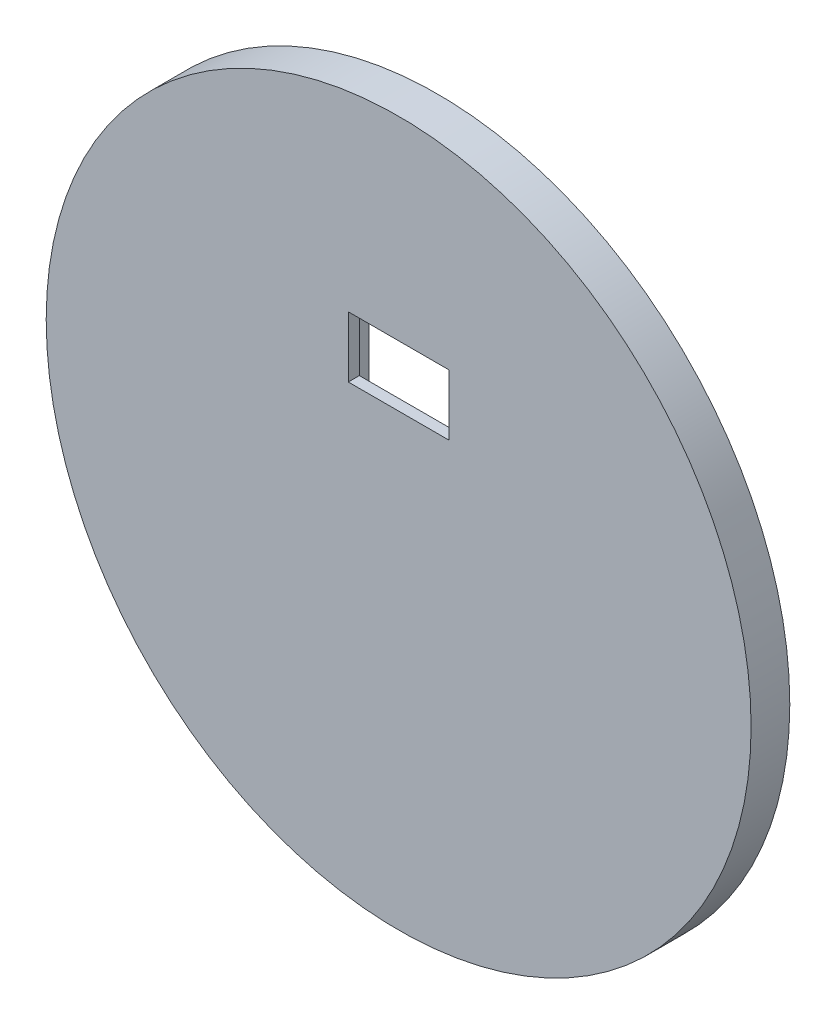
ISO-10303-21;
HEADER;
FILE_DESCRIPTION(('STEP AP214'),'2;1');
FILE_NAME('part.step','',(''),(''),'','','');
FILE_SCHEMA(('AUTOMOTIVE_DESIGN { 1 0 10303 214 1 1 1 1 }'));
ENDSEC;
DATA;
#1=APPLICATION_CONTEXT('core data for automotive mechanical design processes');
#2=APPLICATION_PROTOCOL_DEFINITION('international standard','automotive_design',2000,#1);
#3=PRODUCT_CONTEXT('',#1,'mechanical');
#4=PRODUCT('Part','Part','',(#3));
#5=PRODUCT_RELATED_PRODUCT_CATEGORY('part','',(#4));
#6=PRODUCT_DEFINITION_FORMATION('','',#4);
#7=PRODUCT_DEFINITION_CONTEXT('part definition',#1,'design');
#8=PRODUCT_DEFINITION('design','',#6,#7);
#9=PRODUCT_DEFINITION_SHAPE('','',#8);
#10=(LENGTH_UNIT() NAMED_UNIT(*) SI_UNIT(.MILLI.,.METRE.));
#11=(NAMED_UNIT(*) PLANE_ANGLE_UNIT() SI_UNIT($,.RADIAN.));
#12=(NAMED_UNIT(*) SI_UNIT($,.STERADIAN.) SOLID_ANGLE_UNIT());
#13=UNCERTAINTY_MEASURE_WITH_UNIT(LENGTH_MEASURE(1.E-05),#10,'distance_accuracy_value','');
#14=(GEOMETRIC_REPRESENTATION_CONTEXT(3) GLOBAL_UNCERTAINTY_ASSIGNED_CONTEXT((#13)) GLOBAL_UNIT_ASSIGNED_CONTEXT((#10,
#11,#12)) REPRESENTATION_CONTEXT('',''));
#15=CARTESIAN_POINT('',(0.,0.,0.));
#16=DIRECTION('',(0.,0.,1.));
#17=DIRECTION('',(1.,0.,0.));
#18=AXIS2_PLACEMENT_3D('',#15,#16,#17);
#19=CARTESIAN_POINT('',(0.,0.,7.));
#20=DIRECTION('',(0.,0.,-1.));
#21=DIRECTION('',(-1.,0.,0.));
#22=AXIS2_PLACEMENT_3D('',#19,#20,#21);
#23=CYLINDRICAL_SURFACE('',#22,63.76);
#24=CARTESIAN_POINT('',(0.,0.,7.));
#25=DIRECTION('',(0.,0.,1.));
#26=DIRECTION('',(1.,0.,0.));
#27=AXIS2_PLACEMENT_3D('',#24,#25,#26);
#28=CIRCLE('',#27,63.76);
#29=CARTESIAN_POINT('',(63.76,0.,7.));
#30=VERTEX_POINT('',#29);
#31=EDGE_CURVE('E189',#30,#30,#28,.T.);
#32=ORIENTED_EDGE('',*,*,#31,.F.);
#33=EDGE_LOOP('',(#32));
#34=FACE_BOUND('',#33,.T.);
#35=CARTESIAN_POINT('',(0.,0.,0.));
#36=DIRECTION('',(0.,0.,1.));
#37=DIRECTION('',(1.,0.,0.));
#38=AXIS2_PLACEMENT_3D('',#35,#36,#37);
#39=CIRCLE('',#38,63.76);
#40=CARTESIAN_POINT('',(63.76,0.,0.));
#41=VERTEX_POINT('',#40);
#42=EDGE_CURVE('E178',#41,#41,#39,.T.);
#43=ORIENTED_EDGE('',*,*,#42,.T.);
#44=EDGE_LOOP('',(#43));
#45=FACE_BOUND('',#44,.T.);
#46=ADVANCED_FACE('F39',(#34,#45),#23,.T.);
#47=CARTESIAN_POINT('',(0.,0.,7.));
#48=DIRECTION('',(0.,0.,1.));
#49=DIRECTION('',(1.,0.,0.));
#50=AXIS2_PLACEMENT_3D('',#47,#48,#49);
#51=PLANE('',#50);
#52=DIRECTION('',(0.,1.,0.));
#53=VECTOR('',#52,1.);
#54=CARTESIAN_POINT('',(-9.11201275171163,28.5653825687321,7.));
#55=LINE('',#54,#53);
#56=CARTESIAN_POINT('',(-9.11201275171163,17.5605618518673,7.));
#57=VERTEX_POINT('',#56);
#58=CARTESIAN_POINT('',(-9.11201275171163,28.5653825687321,7.));
#59=VERTEX_POINT('',#58);
#60=EDGE_CURVE('E137',#57,#59,#55,.T.);
#61=ORIENTED_EDGE('',*,*,#60,.T.);
#62=DIRECTION('',(1.,0.,0.));
#63=VECTOR('',#62,1.);
#64=CARTESIAN_POINT('',(9.11201275171163,28.5653825687321,7.));
#65=LINE('',#64,#63);
#66=CARTESIAN_POINT('',(9.11201275171163,28.5653825687321,7.));
#67=VERTEX_POINT('',#66);
#68=EDGE_CURVE('E127',#59,#67,#65,.T.);
#69=ORIENTED_EDGE('',*,*,#68,.T.);
#70=DIRECTION('',(0.,-1.,0.));
#71=VECTOR('',#70,1.);
#72=CARTESIAN_POINT('',(9.11201275171163,28.5653825687321,7.));
#73=LINE('',#72,#71);
#74=CARTESIAN_POINT('',(9.11201275171163,17.5605618518673,7.));
#75=VERTEX_POINT('',#74);
#76=EDGE_CURVE('E153',#67,#75,#73,.T.);
#77=ORIENTED_EDGE('',*,*,#76,.T.);
#78=DIRECTION('',(-1.,0.,0.));
#79=VECTOR('',#78,1.);
#80=CARTESIAN_POINT('',(9.11201275171163,17.5605618518673,7.));
#81=LINE('',#80,#79);
#82=EDGE_CURVE('E149',#75,#57,#81,.T.);
#83=ORIENTED_EDGE('',*,*,#82,.T.);
#84=EDGE_LOOP('',(#61,#69,#77,#83));
#85=FACE_BOUND('',#84,.T.);
#86=ORIENTED_EDGE('',*,*,#31,.T.);
#87=EDGE_LOOP('',(#86));
#88=FACE_BOUND('',#87,.T.);
#89=ADVANCED_FACE('F150',(#85,#88),#51,.T.);
#90=CARTESIAN_POINT('',(0.,0.,0.));
#91=DIRECTION('',(0.,0.,1.));
#92=DIRECTION('',(1.,0.,0.));
#93=AXIS2_PLACEMENT_3D('',#90,#91,#92);
#94=PLANE('',#93);
#95=DIRECTION('',(-1.,0.,0.));
#96=VECTOR('',#95,1.);
#97=CARTESIAN_POINT('',(12.4,-12.42,0.));
#98=LINE('',#97,#96);
#99=CARTESIAN_POINT('',(6.05,-12.42,0.));
#100=VERTEX_POINT('',#99);
#101=CARTESIAN_POINT('',(-6.05,-12.42,0.));
#102=VERTEX_POINT('',#101);
#103=EDGE_CURVE('E182',#100,#102,#98,.T.);
#104=ORIENTED_EDGE('',*,*,#103,.F.);
#105=CARTESIAN_POINT('',(6.05,-6.07,0.));
#106=DIRECTION('',(0.,0.,1.));
#107=DIRECTION('',(1.,0.,0.));
#108=AXIS2_PLACEMENT_3D('',#105,#106,#107);
#109=CIRCLE('',#108,6.35);
#110=CARTESIAN_POINT('',(12.4,-6.06999999999999,0.));
#111=VERTEX_POINT('',#110);
#112=EDGE_CURVE('E50',#100,#111,#109,.T.);
#113=ORIENTED_EDGE('',*,*,#112,.T.);
#114=DIRECTION('',(0.,-1.,0.));
#115=VECTOR('',#114,1.);
#116=CARTESIAN_POINT('',(12.4,32.91,0.));
#117=LINE('',#116,#115);
#118=CARTESIAN_POINT('',(12.4,26.56,0.));
#119=VERTEX_POINT('',#118);
#120=EDGE_CURVE('E134',#119,#111,#117,.T.);
#121=ORIENTED_EDGE('',*,*,#120,.F.);
#122=CARTESIAN_POINT('',(6.05,26.56,0.));
#123=DIRECTION('',(0.,0.,1.));
#124=DIRECTION('',(1.,0.,0.));
#125=AXIS2_PLACEMENT_3D('',#122,#123,#124);
#126=CIRCLE('',#125,6.35);
#127=CARTESIAN_POINT('',(6.05,32.91,0.));
#128=VERTEX_POINT('',#127);
#129=EDGE_CURVE('E225',#119,#128,#126,.T.);
#130=ORIENTED_EDGE('',*,*,#129,.T.);
#131=DIRECTION('',(1.,0.,0.));
#132=VECTOR('',#131,1.);
#133=CARTESIAN_POINT('',(12.4,32.91,0.));
#134=LINE('',#133,#132);
#135=CARTESIAN_POINT('',(-6.04999999999999,32.91,0.));
#136=VERTEX_POINT('',#135);
#137=EDGE_CURVE('E166',#136,#128,#134,.T.);
#138=ORIENTED_EDGE('',*,*,#137,.F.);
#139=CARTESIAN_POINT('',(-6.05,26.56,0.));
#140=DIRECTION('',(0.,0.,1.));
#141=DIRECTION('',(1.,0.,0.));
#142=AXIS2_PLACEMENT_3D('',#139,#140,#141);
#143=CIRCLE('',#142,6.35);
#144=CARTESIAN_POINT('',(-12.4,26.56,0.));
#145=VERTEX_POINT('',#144);
#146=EDGE_CURVE('E221',#136,#145,#143,.T.);
#147=ORIENTED_EDGE('',*,*,#146,.T.);
#148=DIRECTION('',(0.,1.,0.));
#149=VECTOR('',#148,1.);
#150=CARTESIAN_POINT('',(-12.4,32.91,0.));
#151=LINE('',#150,#149);
#152=CARTESIAN_POINT('',(-12.4,-6.06999999999999,0.));
#153=VERTEX_POINT('',#152);
#154=EDGE_CURVE('E184',#153,#145,#151,.T.);
#155=ORIENTED_EDGE('',*,*,#154,.F.);
#156=CARTESIAN_POINT('',(-6.05,-6.07,0.));
#157=DIRECTION('',(0.,0.,1.));
#158=DIRECTION('',(1.,0.,0.));
#159=AXIS2_PLACEMENT_3D('',#156,#157,#158);
#160=CIRCLE('',#159,6.35);
#161=EDGE_CURVE('E11',#153,#102,#160,.T.);
#162=ORIENTED_EDGE('',*,*,#161,.T.);
#163=EDGE_LOOP('',(#104,#113,#121,#130,#138,#147,#155,#162));
#164=FACE_BOUND('',#163,.T.);
#165=ORIENTED_EDGE('',*,*,#42,.F.);
#166=EDGE_LOOP('',(#165));
#167=FACE_BOUND('',#166,.T.);
#168=ADVANCED_FACE('F226',(#164,#167),#94,.F.);
#169=CARTESIAN_POINT('',(12.4,32.91,5.));
#170=DIRECTION('',(1.,0.,0.));
#171=DIRECTION('',(0.,1.,0.));
#172=AXIS2_PLACEMENT_3D('',#169,#170,#171);
#173=PLANE('',#172);
#174=DIRECTION('',(0.,-1.,0.));
#175=VECTOR('',#174,1.);
#176=CARTESIAN_POINT('',(12.4,32.91,5.));
#177=LINE('',#176,#175);
#178=CARTESIAN_POINT('',(12.4,26.56,5.));
#179=VERTEX_POINT('',#178);
#180=CARTESIAN_POINT('',(12.4,-6.06999999999999,5.));
#181=VERTEX_POINT('',#180);
#182=EDGE_CURVE('E164',#179,#181,#177,.T.);
#183=ORIENTED_EDGE('',*,*,#182,.F.);
#184=DIRECTION('',(0.,0.,-1.));
#185=VECTOR('',#184,1.);
#186=CARTESIAN_POINT('',(12.4,26.56,0.));
#187=LINE('',#186,#185);
#188=EDGE_CURVE('E198',#179,#119,#187,.T.);
#189=ORIENTED_EDGE('',*,*,#188,.T.);
#190=ORIENTED_EDGE('',*,*,#120,.T.);
#191=DIRECTION('',(0.,0.,-1.));
#192=VECTOR('',#191,1.);
#193=CARTESIAN_POINT('',(12.4,-6.07,5.));
#194=LINE('',#193,#192);
#195=EDGE_CURVE('E195',#111,#181,#194,.F.);
#196=ORIENTED_EDGE('',*,*,#195,.T.);
#197=EDGE_LOOP('',(#183,#189,#190,#196));
#198=FACE_BOUND('',#197,.T.);
#199=ADVANCED_FACE('F234',(#198),#173,.F.);
#200=CARTESIAN_POINT('',(12.4,32.91,5.));
#201=DIRECTION('',(0.,1.,0.));
#202=DIRECTION('',(0.,0.,1.));
#203=AXIS2_PLACEMENT_3D('',#200,#201,#202);
#204=PLANE('',#203);
#205=ORIENTED_EDGE('',*,*,#137,.T.);
#206=DIRECTION('',(0.,0.,-1.));
#207=VECTOR('',#206,1.);
#208=CARTESIAN_POINT('',(6.05,32.91,5.));
#209=LINE('',#208,#207);
#210=CARTESIAN_POINT('',(6.05,32.91,5.));
#211=VERTEX_POINT('',#210);
#212=EDGE_CURVE('E205',#128,#211,#209,.F.);
#213=ORIENTED_EDGE('',*,*,#212,.T.);
#214=DIRECTION('',(1.,0.,0.));
#215=VECTOR('',#214,1.);
#216=CARTESIAN_POINT('',(12.4,32.91,5.));
#217=LINE('',#216,#215);
#218=CARTESIAN_POINT('',(-6.04999999999999,32.91,5.));
#219=VERTEX_POINT('',#218);
#220=EDGE_CURVE('E172',#219,#211,#217,.T.);
#221=ORIENTED_EDGE('',*,*,#220,.F.);
#222=DIRECTION('',(0.,0.,-1.));
#223=VECTOR('',#222,1.);
#224=CARTESIAN_POINT('',(-6.05,32.91,0.));
#225=LINE('',#224,#223);
#226=EDGE_CURVE('E200',#219,#136,#225,.T.);
#227=ORIENTED_EDGE('',*,*,#226,.T.);
#228=EDGE_LOOP('',(#205,#213,#221,#227));
#229=FACE_BOUND('',#228,.T.);
#230=ADVANCED_FACE('F257',(#229),#204,.F.);
#231=CARTESIAN_POINT('',(-12.4,32.91,5.));
#232=DIRECTION('',(-1.,0.,0.));
#233=DIRECTION('',(0.,-1.,0.));
#234=AXIS2_PLACEMENT_3D('',#231,#232,#233);
#235=PLANE('',#234);
#236=ORIENTED_EDGE('',*,*,#154,.T.);
#237=DIRECTION('',(0.,0.,-1.));
#238=VECTOR('',#237,1.);
#239=CARTESIAN_POINT('',(-12.4,26.56,5.));
#240=LINE('',#239,#238);
#241=CARTESIAN_POINT('',(-12.4,26.56,5.));
#242=VERTEX_POINT('',#241);
#243=EDGE_CURVE('E214',#145,#242,#240,.F.);
#244=ORIENTED_EDGE('',*,*,#243,.T.);
#245=DIRECTION('',(0.,1.,0.));
#246=VECTOR('',#245,1.);
#247=CARTESIAN_POINT('',(-12.4,32.91,5.));
#248=LINE('',#247,#246);
#249=CARTESIAN_POINT('',(-12.4,-6.06999999999999,5.));
#250=VERTEX_POINT('',#249);
#251=EDGE_CURVE('E175',#250,#242,#248,.T.);
#252=ORIENTED_EDGE('',*,*,#251,.F.);
#253=DIRECTION('',(0.,0.,-1.));
#254=VECTOR('',#253,1.);
#255=CARTESIAN_POINT('',(-12.4,-6.07,0.));
#256=LINE('',#255,#254);
#257=EDGE_CURVE('E215',#250,#153,#256,.T.);
#258=ORIENTED_EDGE('',*,*,#257,.T.);
#259=EDGE_LOOP('',(#236,#244,#252,#258));
#260=FACE_BOUND('',#259,.T.);
#261=ADVANCED_FACE('F253',(#260),#235,.F.);
#262=CARTESIAN_POINT('',(12.4,-12.42,5.));
#263=DIRECTION('',(0.,-1.,0.));
#264=DIRECTION('',(0.,0.,-1.));
#265=AXIS2_PLACEMENT_3D('',#262,#263,#264);
#266=PLANE('',#265);
#267=DIRECTION('',(-1.,0.,0.));
#268=VECTOR('',#267,1.);
#269=CARTESIAN_POINT('',(12.4,-12.42,5.));
#270=LINE('',#269,#268);
#271=CARTESIAN_POINT('',(6.05,-12.42,5.));
#272=VERTEX_POINT('',#271);
#273=CARTESIAN_POINT('',(-6.05,-12.42,5.));
#274=VERTEX_POINT('',#273);
#275=EDGE_CURVE('E169',#272,#274,#270,.T.);
#276=ORIENTED_EDGE('',*,*,#275,.F.);
#277=DIRECTION('',(0.,0.,-1.));
#278=VECTOR('',#277,1.);
#279=CARTESIAN_POINT('',(6.05,-12.42,0.));
#280=LINE('',#279,#278);
#281=EDGE_CURVE('E218',#272,#100,#280,.T.);
#282=ORIENTED_EDGE('',*,*,#281,.T.);
#283=ORIENTED_EDGE('',*,*,#103,.T.);
#284=DIRECTION('',(0.,0.,-1.));
#285=VECTOR('',#284,1.);
#286=CARTESIAN_POINT('',(-6.05,-12.42,5.));
#287=LINE('',#286,#285);
#288=EDGE_CURVE('E220',#102,#274,#287,.F.);
#289=ORIENTED_EDGE('',*,*,#288,.T.);
#290=EDGE_LOOP('',(#276,#282,#283,#289));
#291=FACE_BOUND('',#290,.T.);
#292=ADVANCED_FACE('F244',(#291),#266,.F.);
#293=CARTESIAN_POINT('',(0.,0.,5.));
#294=DIRECTION('',(0.,0.,-1.));
#295=DIRECTION('',(-1.,0.,0.));
#296=AXIS2_PLACEMENT_3D('',#293,#294,#295);
#297=PLANE('',#296);
#298=DIRECTION('',(0.,1.,0.));
#299=VECTOR('',#298,1.);
#300=CARTESIAN_POINT('',(-9.11201275171163,28.5653825687321,5.));
#301=LINE('',#300,#299);
#302=CARTESIAN_POINT('',(-9.11201275171163,17.5605618518673,5.));
#303=VERTEX_POINT('',#302);
#304=CARTESIAN_POINT('',(-9.11201275171163,28.5653825687321,5.));
#305=VERTEX_POINT('',#304);
#306=EDGE_CURVE('E142',#303,#305,#301,.T.);
#307=ORIENTED_EDGE('',*,*,#306,.F.);
#308=DIRECTION('',(-1.,0.,0.));
#309=VECTOR('',#308,1.);
#310=CARTESIAN_POINT('',(9.11201275171163,17.5605618518673,5.));
#311=LINE('',#310,#309);
#312=CARTESIAN_POINT('',(9.11201275171163,17.5605618518673,5.));
#313=VERTEX_POINT('',#312);
#314=EDGE_CURVE('E145',#313,#303,#311,.T.);
#315=ORIENTED_EDGE('',*,*,#314,.F.);
#316=DIRECTION('',(0.,-1.,0.));
#317=VECTOR('',#316,1.);
#318=CARTESIAN_POINT('',(9.11201275171163,28.5653825687321,5.));
#319=LINE('',#318,#317);
#320=CARTESIAN_POINT('',(9.11201275171163,28.5653825687321,5.));
#321=VERTEX_POINT('',#320);
#322=EDGE_CURVE('E53',#321,#313,#319,.T.);
#323=ORIENTED_EDGE('',*,*,#322,.F.);
#324=DIRECTION('',(1.,0.,0.));
#325=VECTOR('',#324,1.);
#326=CARTESIAN_POINT('',(9.11201275171163,28.5653825687321,5.));
#327=LINE('',#326,#325);
#328=EDGE_CURVE('E151',#305,#321,#327,.T.);
#329=ORIENTED_EDGE('',*,*,#328,.F.);
#330=EDGE_LOOP('',(#307,#315,#323,#329));
#331=FACE_BOUND('',#330,.T.);
#332=ORIENTED_EDGE('',*,*,#220,.T.);
#333=CARTESIAN_POINT('',(6.05,26.56,5.));
#334=DIRECTION('',(0.,0.,-1.));
#335=DIRECTION('',(-1.,0.,0.));
#336=AXIS2_PLACEMENT_3D('',#333,#334,#335);
#337=CIRCLE('',#336,6.35);
#338=EDGE_CURVE('E209',#211,#179,#337,.T.);
#339=ORIENTED_EDGE('',*,*,#338,.T.);
#340=ORIENTED_EDGE('',*,*,#182,.T.);
#341=CARTESIAN_POINT('',(6.05,-6.07,5.));
#342=DIRECTION('',(0.,0.,-1.));
#343=DIRECTION('',(-1.,0.,0.));
#344=AXIS2_PLACEMENT_3D('',#341,#342,#343);
#345=CIRCLE('',#344,6.35);
#346=EDGE_CURVE('E206',#181,#272,#345,.T.);
#347=ORIENTED_EDGE('',*,*,#346,.T.);
#348=ORIENTED_EDGE('',*,*,#275,.T.);
#349=CARTESIAN_POINT('',(-6.05,-6.07,5.));
#350=DIRECTION('',(0.,0.,-1.));
#351=DIRECTION('',(-1.,0.,0.));
#352=AXIS2_PLACEMENT_3D('',#349,#350,#351);
#353=CIRCLE('',#352,6.35);
#354=EDGE_CURVE('E204',#274,#250,#353,.T.);
#355=ORIENTED_EDGE('',*,*,#354,.T.);
#356=ORIENTED_EDGE('',*,*,#251,.T.);
#357=CARTESIAN_POINT('',(-6.05,26.56,5.));
#358=DIRECTION('',(0.,0.,-1.));
#359=DIRECTION('',(-1.,0.,0.));
#360=AXIS2_PLACEMENT_3D('',#357,#358,#359);
#361=CIRCLE('',#360,6.35);
#362=EDGE_CURVE('E208',#242,#219,#361,.T.);
#363=ORIENTED_EDGE('',*,*,#362,.T.);
#364=EDGE_LOOP('',(#332,#339,#340,#347,#348,#355,#356,#363));
#365=FACE_BOUND('',#364,.T.);
#366=ADVANCED_FACE('F243',(#331,#365),#297,.T.);
#367=CARTESIAN_POINT('',(6.05,26.56,5.));
#368=DIRECTION('',(0.,0.,1.));
#369=DIRECTION('',(1.,0.,0.));
#370=AXIS2_PLACEMENT_3D('',#367,#368,#369);
#371=CYLINDRICAL_SURFACE('',#370,6.35);
#372=ORIENTED_EDGE('',*,*,#338,.F.);
#373=ORIENTED_EDGE('',*,*,#212,.F.);
#374=ORIENTED_EDGE('',*,*,#129,.F.);
#375=ORIENTED_EDGE('',*,*,#188,.F.);
#376=EDGE_LOOP('',(#372,#373,#374,#375));
#377=FACE_BOUND('',#376,.T.);
#378=ADVANCED_FACE('F262',(#377),#371,.F.);
#379=CARTESIAN_POINT('',(-6.05,26.56,5.));
#380=DIRECTION('',(0.,0.,1.));
#381=DIRECTION('',(1.,0.,0.));
#382=AXIS2_PLACEMENT_3D('',#379,#380,#381);
#383=CYLINDRICAL_SURFACE('',#382,6.35);
#384=ORIENTED_EDGE('',*,*,#362,.F.);
#385=ORIENTED_EDGE('',*,*,#243,.F.);
#386=ORIENTED_EDGE('',*,*,#146,.F.);
#387=ORIENTED_EDGE('',*,*,#226,.F.);
#388=EDGE_LOOP('',(#384,#385,#386,#387));
#389=FACE_BOUND('',#388,.T.);
#390=ADVANCED_FACE('F254',(#389),#383,.F.);
#391=CARTESIAN_POINT('',(6.05,-6.07,5.));
#392=DIRECTION('',(0.,0.,1.));
#393=DIRECTION('',(1.,0.,0.));
#394=AXIS2_PLACEMENT_3D('',#391,#392,#393);
#395=CYLINDRICAL_SURFACE('',#394,6.35);
#396=ORIENTED_EDGE('',*,*,#346,.F.);
#397=ORIENTED_EDGE('',*,*,#195,.F.);
#398=ORIENTED_EDGE('',*,*,#112,.F.);
#399=ORIENTED_EDGE('',*,*,#281,.F.);
#400=EDGE_LOOP('',(#396,#397,#398,#399));
#401=FACE_BOUND('',#400,.T.);
#402=ADVANCED_FACE('F236',(#401),#395,.F.);
#403=CARTESIAN_POINT('',(-6.05,-6.07,5.));
#404=DIRECTION('',(0.,0.,1.));
#405=DIRECTION('',(1.,0.,0.));
#406=AXIS2_PLACEMENT_3D('',#403,#404,#405);
#407=CYLINDRICAL_SURFACE('',#406,6.35);
#408=ORIENTED_EDGE('',*,*,#354,.F.);
#409=ORIENTED_EDGE('',*,*,#288,.F.);
#410=ORIENTED_EDGE('',*,*,#161,.F.);
#411=ORIENTED_EDGE('',*,*,#257,.F.);
#412=EDGE_LOOP('',(#408,#409,#410,#411));
#413=FACE_BOUND('',#412,.T.);
#414=ADVANCED_FACE('F41',(#413),#407,.F.);
#415=CARTESIAN_POINT('',(-9.11201275171163,28.5653825687321,7.001));
#416=DIRECTION('',(-1.,0.,0.));
#417=DIRECTION('',(0.,0.,1.));
#418=AXIS2_PLACEMENT_3D('',#415,#416,#417);
#419=PLANE('',#418);
#420=DIRECTION('',(0.,0.,-1.));
#421=VECTOR('',#420,1.);
#422=CARTESIAN_POINT('',(-9.11201275171163,17.5605618518673,7.001));
#423=LINE('',#422,#421);
#424=EDGE_CURVE('E132',#57,#303,#423,.T.);
#425=ORIENTED_EDGE('',*,*,#424,.T.);
#426=ORIENTED_EDGE('',*,*,#306,.T.);
#427=DIRECTION('',(0.,0.,-1.));
#428=VECTOR('',#427,1.);
#429=CARTESIAN_POINT('',(-9.11201275171163,28.5653825687321,7.001));
#430=LINE('',#429,#428);
#431=EDGE_CURVE('E129',#59,#305,#430,.T.);
#432=ORIENTED_EDGE('',*,*,#431,.F.);
#433=ORIENTED_EDGE('',*,*,#60,.F.);
#434=EDGE_LOOP('',(#425,#426,#432,#433));
#435=FACE_BOUND('',#434,.T.);
#436=ADVANCED_FACE('F138',(#435),#419,.F.);
#437=CARTESIAN_POINT('',(9.11201275171163,17.5605618518673,7.001));
#438=DIRECTION('',(0.,-1.,0.));
#439=DIRECTION('',(0.,0.,-1.));
#440=AXIS2_PLACEMENT_3D('',#437,#438,#439);
#441=PLANE('',#440);
#442=DIRECTION('',(0.,0.,-1.));
#443=VECTOR('',#442,1.);
#444=CARTESIAN_POINT('',(9.11201275171163,17.5605618518673,7.001));
#445=LINE('',#444,#443);
#446=EDGE_CURVE('E165',#75,#313,#445,.T.);
#447=ORIENTED_EDGE('',*,*,#446,.T.);
#448=ORIENTED_EDGE('',*,*,#314,.T.);
#449=ORIENTED_EDGE('',*,*,#424,.F.);
#450=ORIENTED_EDGE('',*,*,#82,.F.);
#451=EDGE_LOOP('',(#447,#448,#449,#450));
#452=FACE_BOUND('',#451,.T.);
#453=ADVANCED_FACE('F298',(#452),#441,.F.);
#454=CARTESIAN_POINT('',(9.11201275171163,28.5653825687321,7.001));
#455=DIRECTION('',(1.,0.,0.));
#456=DIRECTION('',(0.,0.,-1.));
#457=AXIS2_PLACEMENT_3D('',#454,#455,#456);
#458=PLANE('',#457);
#459=DIRECTION('',(0.,0.,-1.));
#460=VECTOR('',#459,1.);
#461=CARTESIAN_POINT('',(9.11201275171163,28.5653825687321,7.001));
#462=LINE('',#461,#460);
#463=EDGE_CURVE('E63',#67,#321,#462,.T.);
#464=ORIENTED_EDGE('',*,*,#463,.T.);
#465=ORIENTED_EDGE('',*,*,#322,.T.);
#466=ORIENTED_EDGE('',*,*,#446,.F.);
#467=ORIENTED_EDGE('',*,*,#76,.F.);
#468=EDGE_LOOP('',(#464,#465,#466,#467));
#469=FACE_BOUND('',#468,.T.);
#470=ADVANCED_FACE('F299',(#469),#458,.F.);
#471=CARTESIAN_POINT('',(9.11201275171163,28.5653825687321,7.001));
#472=DIRECTION('',(0.,1.,0.));
#473=DIRECTION('',(0.,0.,1.));
#474=AXIS2_PLACEMENT_3D('',#471,#472,#473);
#475=PLANE('',#474);
#476=ORIENTED_EDGE('',*,*,#431,.T.);
#477=ORIENTED_EDGE('',*,*,#328,.T.);
#478=ORIENTED_EDGE('',*,*,#463,.F.);
#479=ORIENTED_EDGE('',*,*,#68,.F.);
#480=EDGE_LOOP('',(#476,#477,#478,#479));
#481=FACE_BOUND('',#480,.T.);
#482=ADVANCED_FACE('F126',(#481),#475,.F.);
#483=CLOSED_SHELL('',(#46,#89,#168,#199,#230,#261,#292,#366,#378,#390,#402,#414,#436,#453,#470,#482));
#484=MANIFOLD_SOLID_BREP('B2',#483);
#485=ADVANCED_BREP_SHAPE_REPRESENTATION('',(#18,#484),#14);
#486=SHAPE_DEFINITION_REPRESENTATION(#9,#485);
ENDSEC;
END-ISO-10303-21;
